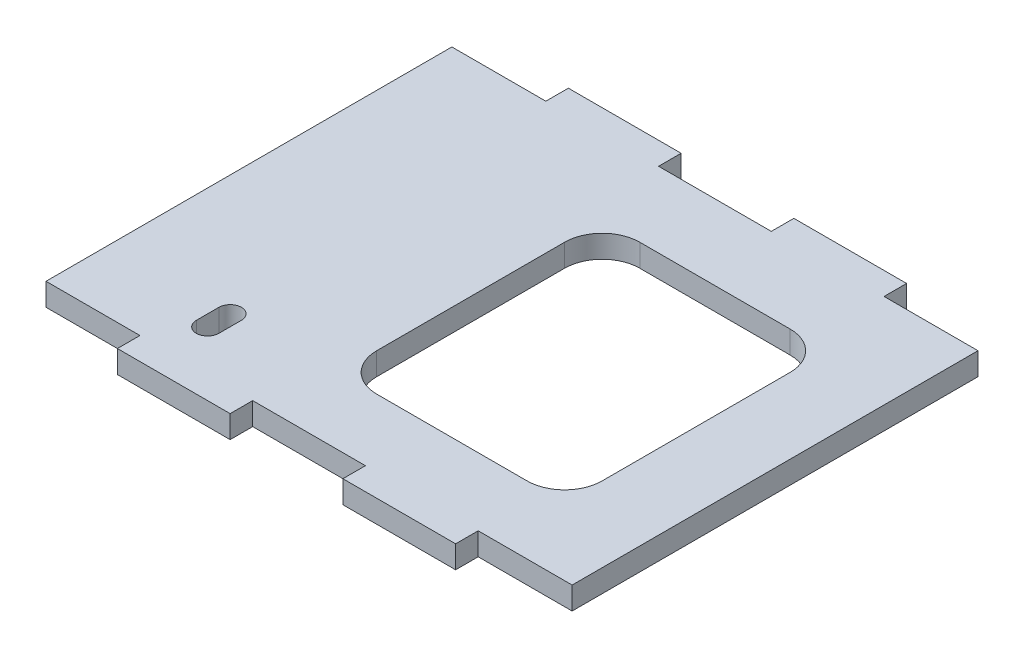
ISO-10303-21;
HEADER;
FILE_DESCRIPTION(('STEP AP214'),'2;1');
FILE_NAME('part.step','',(''),(''),'','','');
FILE_SCHEMA(('AUTOMOTIVE_DESIGN { 1 0 10303 214 1 1 1 1 }'));
ENDSEC;
DATA;
#1=APPLICATION_CONTEXT('core data for automotive mechanical design processes');
#2=APPLICATION_PROTOCOL_DEFINITION('international standard','automotive_design',2000,#1);
#3=PRODUCT_CONTEXT('',#1,'mechanical');
#4=PRODUCT('Part','Part','',(#3));
#5=PRODUCT_RELATED_PRODUCT_CATEGORY('part','',(#4));
#6=PRODUCT_DEFINITION_FORMATION('','',#4);
#7=PRODUCT_DEFINITION_CONTEXT('part definition',#1,'design');
#8=PRODUCT_DEFINITION('design','',#6,#7);
#9=PRODUCT_DEFINITION_SHAPE('','',#8);
#10=(LENGTH_UNIT() NAMED_UNIT(*) SI_UNIT(.MILLI.,.METRE.));
#11=(NAMED_UNIT(*) PLANE_ANGLE_UNIT() SI_UNIT($,.RADIAN.));
#12=(NAMED_UNIT(*) SI_UNIT($,.STERADIAN.) SOLID_ANGLE_UNIT());
#13=UNCERTAINTY_MEASURE_WITH_UNIT(LENGTH_MEASURE(1.E-05),#10,'distance_accuracy_value','');
#14=(GEOMETRIC_REPRESENTATION_CONTEXT(3) GLOBAL_UNCERTAINTY_ASSIGNED_CONTEXT((#13)) GLOBAL_UNIT_ASSIGNED_CONTEXT((#10,
#11,#12)) REPRESENTATION_CONTEXT('',''));
#15=CARTESIAN_POINT('',(0.,0.,0.));
#16=DIRECTION('',(0.,0.,1.));
#17=DIRECTION('',(1.,0.,0.));
#18=AXIS2_PLACEMENT_3D('',#15,#16,#17);
#19=CARTESIAN_POINT('',(-34.9999999999999,3.,27.0000000000001));
#20=DIRECTION('',(1.,0.,0.));
#21=DIRECTION('',(0.,0.,-1.));
#22=AXIS2_PLACEMENT_3D('',#19,#20,#21);
#23=PLANE('',#22);
#24=DIRECTION('',(0.,0.,1.));
#25=VECTOR('',#24,1.);
#26=CARTESIAN_POINT('',(-34.9999999999999,0.,27.0000000000001));
#27=LINE('',#26,#25);
#28=CARTESIAN_POINT('',(-34.9999999999999,0.,-27.));
#29=VERTEX_POINT('',#28);
#30=CARTESIAN_POINT('',(-34.9999999999999,0.,27.0000000000001));
#31=VERTEX_POINT('',#30);
#32=EDGE_CURVE('E326',#29,#31,#27,.T.);
#33=ORIENTED_EDGE('',*,*,#32,.T.);
#34=DIRECTION('',(0.,-1.,0.));
#35=VECTOR('',#34,1.);
#36=CARTESIAN_POINT('',(-34.9999999999999,3.,27.0000000000001));
#37=LINE('',#36,#35);
#38=CARTESIAN_POINT('',(-34.9999999999999,3.,27.0000000000001));
#39=VERTEX_POINT('',#38);
#40=EDGE_CURVE('E11',#39,#31,#37,.T.);
#41=ORIENTED_EDGE('',*,*,#40,.F.);
#42=DIRECTION('',(0.,0.,1.));
#43=VECTOR('',#42,1.);
#44=CARTESIAN_POINT('',(-34.9999999999999,3.,27.0000000000001));
#45=LINE('',#44,#43);
#46=CARTESIAN_POINT('',(-34.9999999999999,3.,-27.));
#47=VERTEX_POINT('',#46);
#48=EDGE_CURVE('E341',#47,#39,#45,.T.);
#49=ORIENTED_EDGE('',*,*,#48,.F.);
#50=DIRECTION('',(0.,-1.,0.));
#51=VECTOR('',#50,1.);
#52=CARTESIAN_POINT('',(-34.9999999999999,3.,-27.));
#53=LINE('',#52,#51);
#54=EDGE_CURVE('E383',#47,#29,#53,.T.);
#55=ORIENTED_EDGE('',*,*,#54,.T.);
#56=EDGE_LOOP('',(#33,#41,#49,#55));
#57=FACE_BOUND('',#56,.T.);
#58=ADVANCED_FACE('F32',(#57),#23,.F.);
#59=CARTESIAN_POINT('',(-22.4999999999999,3.,27.0000000000001));
#60=DIRECTION('',(0.,0.,-1.));
#61=DIRECTION('',(-1.,0.,0.));
#62=AXIS2_PLACEMENT_3D('',#59,#60,#61);
#63=PLANE('',#62);
#64=DIRECTION('',(1.,0.,0.));
#65=VECTOR('',#64,1.);
#66=CARTESIAN_POINT('',(-22.4999999999999,0.,27.0000000000001));
#67=LINE('',#66,#65);
#68=CARTESIAN_POINT('',(-22.4999999999999,0.,27.0000000000001));
#69=VERTEX_POINT('',#68);
#70=EDGE_CURVE('E386',#31,#69,#67,.T.);
#71=ORIENTED_EDGE('',*,*,#70,.T.);
#72=DIRECTION('',(0.,-1.,0.));
#73=VECTOR('',#72,1.);
#74=CARTESIAN_POINT('',(-22.4999999999999,3.,27.0000000000001));
#75=LINE('',#74,#73);
#76=CARTESIAN_POINT('',(-22.4999999999999,3.,27.0000000000001));
#77=VERTEX_POINT('',#76);
#78=EDGE_CURVE('E39',#77,#69,#75,.T.);
#79=ORIENTED_EDGE('',*,*,#78,.F.);
#80=DIRECTION('',(1.,0.,0.));
#81=VECTOR('',#80,1.);
#82=CARTESIAN_POINT('',(-22.4999999999999,3.,27.0000000000001));
#83=LINE('',#82,#81);
#84=EDGE_CURVE('E344',#39,#77,#83,.T.);
#85=ORIENTED_EDGE('',*,*,#84,.F.);
#86=ORIENTED_EDGE('',*,*,#40,.T.);
#87=EDGE_LOOP('',(#71,#79,#85,#86));
#88=FACE_BOUND('',#87,.T.);
#89=ADVANCED_FACE('F502',(#88),#63,.F.);
#90=CARTESIAN_POINT('',(-22.5,3.,30.0000000000002));
#91=DIRECTION('',(1.,0.,0.));
#92=DIRECTION('',(0.,0.,-1.));
#93=AXIS2_PLACEMENT_3D('',#90,#91,#92);
#94=PLANE('',#93);
#95=DIRECTION('',(0.,0.,1.));
#96=VECTOR('',#95,1.);
#97=CARTESIAN_POINT('',(-22.5,0.,30.0000000000002));
#98=LINE('',#97,#96);
#99=CARTESIAN_POINT('',(-22.5,0.,30.0000000000002));
#100=VERTEX_POINT('',#99);
#101=EDGE_CURVE('E388',#69,#100,#98,.T.);
#102=ORIENTED_EDGE('',*,*,#101,.T.);
#103=DIRECTION('',(0.,-1.,0.));
#104=VECTOR('',#103,1.);
#105=CARTESIAN_POINT('',(-22.5,3.,30.0000000000002));
#106=LINE('',#105,#104);
#107=CARTESIAN_POINT('',(-22.5,3.,30.0000000000002));
#108=VERTEX_POINT('',#107);
#109=EDGE_CURVE('E473',#108,#100,#106,.T.);
#110=ORIENTED_EDGE('',*,*,#109,.F.);
#111=DIRECTION('',(0.,0.,1.));
#112=VECTOR('',#111,1.);
#113=CARTESIAN_POINT('',(-22.5,3.,30.0000000000002));
#114=LINE('',#113,#112);
#115=EDGE_CURVE('E347',#77,#108,#114,.T.);
#116=ORIENTED_EDGE('',*,*,#115,.F.);
#117=ORIENTED_EDGE('',*,*,#78,.T.);
#118=EDGE_LOOP('',(#102,#110,#116,#117));
#119=FACE_BOUND('',#118,.T.);
#120=ADVANCED_FACE('F480',(#119),#94,.F.);
#121=CARTESIAN_POINT('',(-7.49999999999995,3.,30.0000000000001));
#122=DIRECTION('',(0.,0.,-1.));
#123=DIRECTION('',(-1.,0.,0.));
#124=AXIS2_PLACEMENT_3D('',#121,#122,#123);
#125=PLANE('',#124);
#126=DIRECTION('',(1.,0.,0.));
#127=VECTOR('',#126,1.);
#128=CARTESIAN_POINT('',(-7.49999999999995,0.,30.0000000000001));
#129=LINE('',#128,#127);
#130=CARTESIAN_POINT('',(-7.49999999999995,0.,30.0000000000001));
#131=VERTEX_POINT('',#130);
#132=EDGE_CURVE('E390',#100,#131,#129,.T.);
#133=ORIENTED_EDGE('',*,*,#132,.T.);
#134=DIRECTION('',(0.,-1.,0.));
#135=VECTOR('',#134,1.);
#136=CARTESIAN_POINT('',(-7.49999999999995,3.,30.0000000000001));
#137=LINE('',#136,#135);
#138=CARTESIAN_POINT('',(-7.49999999999995,3.,30.0000000000001));
#139=VERTEX_POINT('',#138);
#140=EDGE_CURVE('E470',#139,#131,#137,.T.);
#141=ORIENTED_EDGE('',*,*,#140,.F.);
#142=DIRECTION('',(1.,0.,0.));
#143=VECTOR('',#142,1.);
#144=CARTESIAN_POINT('',(-7.49999999999995,3.,30.0000000000001));
#145=LINE('',#144,#143);
#146=EDGE_CURVE('E349',#108,#139,#145,.T.);
#147=ORIENTED_EDGE('',*,*,#146,.F.);
#148=ORIENTED_EDGE('',*,*,#109,.T.);
#149=EDGE_LOOP('',(#133,#141,#147,#148));
#150=FACE_BOUND('',#149,.T.);
#151=ADVANCED_FACE('F490',(#150),#125,.F.);
#152=CARTESIAN_POINT('',(-7.49999999999995,3.,27.0000000000001));
#153=DIRECTION('',(-1.,0.,0.));
#154=DIRECTION('',(0.,0.,1.));
#155=AXIS2_PLACEMENT_3D('',#152,#153,#154);
#156=PLANE('',#155);
#157=DIRECTION('',(0.,0.,-1.));
#158=VECTOR('',#157,1.);
#159=CARTESIAN_POINT('',(-7.49999999999995,0.,27.0000000000001));
#160=LINE('',#159,#158);
#161=CARTESIAN_POINT('',(-7.49999999999995,0.,27.0000000000001));
#162=VERTEX_POINT('',#161);
#163=EDGE_CURVE('E392',#131,#162,#160,.T.);
#164=ORIENTED_EDGE('',*,*,#163,.T.);
#165=DIRECTION('',(0.,-1.,0.));
#166=VECTOR('',#165,1.);
#167=CARTESIAN_POINT('',(-7.49999999999995,3.,27.0000000000001));
#168=LINE('',#167,#166);
#169=CARTESIAN_POINT('',(-7.49999999999995,3.,27.0000000000001));
#170=VERTEX_POINT('',#169);
#171=EDGE_CURVE('E467',#170,#162,#168,.T.);
#172=ORIENTED_EDGE('',*,*,#171,.F.);
#173=DIRECTION('',(0.,0.,-1.));
#174=VECTOR('',#173,1.);
#175=CARTESIAN_POINT('',(-7.49999999999995,3.,27.0000000000001));
#176=LINE('',#175,#174);
#177=EDGE_CURVE('E351',#139,#170,#176,.T.);
#178=ORIENTED_EDGE('',*,*,#177,.F.);
#179=ORIENTED_EDGE('',*,*,#140,.T.);
#180=EDGE_LOOP('',(#164,#172,#178,#179));
#181=FACE_BOUND('',#180,.T.);
#182=ADVANCED_FACE('F494',(#181),#156,.F.);
#183=CARTESIAN_POINT('',(7.50000000000017,3.,27.));
#184=DIRECTION('',(0.,0.,-1.));
#185=DIRECTION('',(-1.,0.,0.));
#186=AXIS2_PLACEMENT_3D('',#183,#184,#185);
#187=PLANE('',#186);
#188=DIRECTION('',(1.,0.,0.));
#189=VECTOR('',#188,1.);
#190=CARTESIAN_POINT('',(7.50000000000017,0.,27.));
#191=LINE('',#190,#189);
#192=CARTESIAN_POINT('',(7.50000000000017,0.,27.));
#193=VERTEX_POINT('',#192);
#194=EDGE_CURVE('E394',#162,#193,#191,.T.);
#195=ORIENTED_EDGE('',*,*,#194,.T.);
#196=DIRECTION('',(0.,-1.,0.));
#197=VECTOR('',#196,1.);
#198=CARTESIAN_POINT('',(7.50000000000017,3.,27.));
#199=LINE('',#198,#197);
#200=CARTESIAN_POINT('',(7.50000000000017,3.,27.));
#201=VERTEX_POINT('',#200);
#202=EDGE_CURVE('E464',#201,#193,#199,.T.);
#203=ORIENTED_EDGE('',*,*,#202,.F.);
#204=DIRECTION('',(1.,0.,0.));
#205=VECTOR('',#204,1.);
#206=CARTESIAN_POINT('',(7.50000000000017,3.,27.));
#207=LINE('',#206,#205);
#208=EDGE_CURVE('E353',#170,#201,#207,.T.);
#209=ORIENTED_EDGE('',*,*,#208,.F.);
#210=ORIENTED_EDGE('',*,*,#171,.T.);
#211=EDGE_LOOP('',(#195,#203,#209,#210));
#212=FACE_BOUND('',#211,.T.);
#213=ADVANCED_FACE('F575',(#212),#187,.F.);
#214=CARTESIAN_POINT('',(7.50000000000017,3.,30.0000000000001));
#215=DIRECTION('',(1.,0.,0.));
#216=DIRECTION('',(0.,0.,-1.));
#217=AXIS2_PLACEMENT_3D('',#214,#215,#216);
#218=PLANE('',#217);
#219=DIRECTION('',(0.,0.,1.));
#220=VECTOR('',#219,1.);
#221=CARTESIAN_POINT('',(7.50000000000017,0.,30.0000000000001));
#222=LINE('',#221,#220);
#223=CARTESIAN_POINT('',(7.50000000000017,0.,30.0000000000001));
#224=VERTEX_POINT('',#223);
#225=EDGE_CURVE('E396',#193,#224,#222,.T.);
#226=ORIENTED_EDGE('',*,*,#225,.T.);
#227=DIRECTION('',(0.,-1.,0.));
#228=VECTOR('',#227,1.);
#229=CARTESIAN_POINT('',(7.50000000000017,3.,30.0000000000001));
#230=LINE('',#229,#228);
#231=CARTESIAN_POINT('',(7.50000000000017,3.,30.0000000000001));
#232=VERTEX_POINT('',#231);
#233=EDGE_CURVE('E461',#232,#224,#230,.T.);
#234=ORIENTED_EDGE('',*,*,#233,.F.);
#235=DIRECTION('',(0.,0.,1.));
#236=VECTOR('',#235,1.);
#237=CARTESIAN_POINT('',(7.50000000000017,3.,30.0000000000001));
#238=LINE('',#237,#236);
#239=EDGE_CURVE('E355',#201,#232,#238,.T.);
#240=ORIENTED_EDGE('',*,*,#239,.F.);
#241=ORIENTED_EDGE('',*,*,#202,.T.);
#242=EDGE_LOOP('',(#226,#234,#240,#241));
#243=FACE_BOUND('',#242,.T.);
#244=ADVANCED_FACE('F573',(#243),#218,.F.);
#245=CARTESIAN_POINT('',(22.5000000000001,3.,30.0000000000001));
#246=DIRECTION('',(0.,0.,-1.));
#247=DIRECTION('',(-1.,0.,0.));
#248=AXIS2_PLACEMENT_3D('',#245,#246,#247);
#249=PLANE('',#248);
#250=DIRECTION('',(1.,0.,0.));
#251=VECTOR('',#250,1.);
#252=CARTESIAN_POINT('',(22.5000000000001,0.,30.0000000000001));
#253=LINE('',#252,#251);
#254=CARTESIAN_POINT('',(22.5000000000001,0.,30.0000000000001));
#255=VERTEX_POINT('',#254);
#256=EDGE_CURVE('E398',#224,#255,#253,.T.);
#257=ORIENTED_EDGE('',*,*,#256,.T.);
#258=DIRECTION('',(0.,-1.,0.));
#259=VECTOR('',#258,1.);
#260=CARTESIAN_POINT('',(22.5000000000001,3.,30.0000000000001));
#261=LINE('',#260,#259);
#262=CARTESIAN_POINT('',(22.5000000000001,3.,30.0000000000001));
#263=VERTEX_POINT('',#262);
#264=EDGE_CURVE('E458',#263,#255,#261,.T.);
#265=ORIENTED_EDGE('',*,*,#264,.F.);
#266=DIRECTION('',(1.,0.,0.));
#267=VECTOR('',#266,1.);
#268=CARTESIAN_POINT('',(22.5000000000001,3.,30.0000000000001));
#269=LINE('',#268,#267);
#270=EDGE_CURVE('E357',#232,#263,#269,.T.);
#271=ORIENTED_EDGE('',*,*,#270,.F.);
#272=ORIENTED_EDGE('',*,*,#233,.T.);
#273=EDGE_LOOP('',(#257,#265,#271,#272));
#274=FACE_BOUND('',#273,.T.);
#275=ADVANCED_FACE('F568',(#274),#249,.F.);
#276=CARTESIAN_POINT('',(22.5000000000001,3.,27.0000000000001));
#277=DIRECTION('',(-1.,0.,0.));
#278=DIRECTION('',(0.,0.,1.));
#279=AXIS2_PLACEMENT_3D('',#276,#277,#278);
#280=PLANE('',#279);
#281=DIRECTION('',(0.,0.,-1.));
#282=VECTOR('',#281,1.);
#283=CARTESIAN_POINT('',(22.5000000000001,0.,27.0000000000001));
#284=LINE('',#283,#282);
#285=CARTESIAN_POINT('',(22.5000000000001,0.,27.0000000000001));
#286=VERTEX_POINT('',#285);
#287=EDGE_CURVE('E400',#255,#286,#284,.T.);
#288=ORIENTED_EDGE('',*,*,#287,.T.);
#289=DIRECTION('',(0.,-1.,0.));
#290=VECTOR('',#289,1.);
#291=CARTESIAN_POINT('',(22.5000000000001,3.,27.0000000000001));
#292=LINE('',#291,#290);
#293=CARTESIAN_POINT('',(22.5000000000001,3.,27.0000000000001));
#294=VERTEX_POINT('',#293);
#295=EDGE_CURVE('E455',#294,#286,#292,.T.);
#296=ORIENTED_EDGE('',*,*,#295,.F.);
#297=DIRECTION('',(0.,0.,-1.));
#298=VECTOR('',#297,1.);
#299=CARTESIAN_POINT('',(22.5000000000001,3.,27.0000000000001));
#300=LINE('',#299,#298);
#301=EDGE_CURVE('E359',#263,#294,#300,.T.);
#302=ORIENTED_EDGE('',*,*,#301,.F.);
#303=ORIENTED_EDGE('',*,*,#264,.T.);
#304=EDGE_LOOP('',(#288,#296,#302,#303));
#305=FACE_BOUND('',#304,.T.);
#306=ADVANCED_FACE('F563',(#305),#280,.F.);
#307=CARTESIAN_POINT('',(35.0000000000003,3.,27.));
#308=DIRECTION('',(0.,0.,-1.));
#309=DIRECTION('',(-1.,0.,0.));
#310=AXIS2_PLACEMENT_3D('',#307,#308,#309);
#311=PLANE('',#310);
#312=DIRECTION('',(1.,0.,0.));
#313=VECTOR('',#312,1.);
#314=CARTESIAN_POINT('',(35.0000000000003,0.,27.));
#315=LINE('',#314,#313);
#316=CARTESIAN_POINT('',(35.0000000000003,0.,27.));
#317=VERTEX_POINT('',#316);
#318=EDGE_CURVE('E402',#286,#317,#315,.T.);
#319=ORIENTED_EDGE('',*,*,#318,.T.);
#320=DIRECTION('',(0.,-1.,0.));
#321=VECTOR('',#320,1.);
#322=CARTESIAN_POINT('',(35.0000000000003,3.,27.));
#323=LINE('',#322,#321);
#324=CARTESIAN_POINT('',(35.0000000000003,3.,27.));
#325=VERTEX_POINT('',#324);
#326=EDGE_CURVE('E452',#325,#317,#323,.T.);
#327=ORIENTED_EDGE('',*,*,#326,.F.);
#328=DIRECTION('',(1.,0.,0.));
#329=VECTOR('',#328,1.);
#330=CARTESIAN_POINT('',(35.0000000000003,3.,27.));
#331=LINE('',#330,#329);
#332=EDGE_CURVE('E361',#294,#325,#331,.T.);
#333=ORIENTED_EDGE('',*,*,#332,.F.);
#334=ORIENTED_EDGE('',*,*,#295,.T.);
#335=EDGE_LOOP('',(#319,#327,#333,#334));
#336=FACE_BOUND('',#335,.T.);
#337=ADVANCED_FACE('F559',(#336),#311,.F.);
#338=CARTESIAN_POINT('',(35.0000000000001,3.,-27.0000000000001));
#339=DIRECTION('',(-1.,0.,0.));
#340=DIRECTION('',(0.,0.,1.));
#341=AXIS2_PLACEMENT_3D('',#338,#339,#340);
#342=PLANE('',#341);
#343=DIRECTION('',(0.,0.,-1.));
#344=VECTOR('',#343,1.);
#345=CARTESIAN_POINT('',(35.0000000000001,0.,-27.0000000000001));
#346=LINE('',#345,#344);
#347=CARTESIAN_POINT('',(35.0000000000001,0.,-27.0000000000001));
#348=VERTEX_POINT('',#347);
#349=EDGE_CURVE('E404',#317,#348,#346,.T.);
#350=ORIENTED_EDGE('',*,*,#349,.T.);
#351=DIRECTION('',(0.,-1.,0.));
#352=VECTOR('',#351,1.);
#353=CARTESIAN_POINT('',(35.0000000000001,3.,-27.0000000000001));
#354=LINE('',#353,#352);
#355=CARTESIAN_POINT('',(35.0000000000001,3.,-27.0000000000001));
#356=VERTEX_POINT('',#355);
#357=EDGE_CURVE('E449',#356,#348,#354,.T.);
#358=ORIENTED_EDGE('',*,*,#357,.F.);
#359=DIRECTION('',(0.,0.,-1.));
#360=VECTOR('',#359,1.);
#361=CARTESIAN_POINT('',(35.0000000000001,3.,-27.0000000000001));
#362=LINE('',#361,#360);
#363=EDGE_CURVE('E363',#325,#356,#362,.T.);
#364=ORIENTED_EDGE('',*,*,#363,.F.);
#365=ORIENTED_EDGE('',*,*,#326,.T.);
#366=EDGE_LOOP('',(#350,#358,#364,#365));
#367=FACE_BOUND('',#366,.T.);
#368=ADVANCED_FACE('F554',(#367),#342,.F.);
#369=CARTESIAN_POINT('',(22.5,3.,-27.0000000000001));
#370=DIRECTION('',(0.,0.,1.));
#371=DIRECTION('',(1.,0.,0.));
#372=AXIS2_PLACEMENT_3D('',#369,#370,#371);
#373=PLANE('',#372);
#374=DIRECTION('',(-1.,0.,0.));
#375=VECTOR('',#374,1.);
#376=CARTESIAN_POINT('',(22.5,0.,-27.0000000000001));
#377=LINE('',#376,#375);
#378=CARTESIAN_POINT('',(22.5,0.,-27.0000000000001));
#379=VERTEX_POINT('',#378);
#380=EDGE_CURVE('E406',#348,#379,#377,.T.);
#381=ORIENTED_EDGE('',*,*,#380,.T.);
#382=DIRECTION('',(0.,-1.,0.));
#383=VECTOR('',#382,1.);
#384=CARTESIAN_POINT('',(22.5,3.,-27.0000000000001));
#385=LINE('',#384,#383);
#386=CARTESIAN_POINT('',(22.5,3.,-27.0000000000001));
#387=VERTEX_POINT('',#386);
#388=EDGE_CURVE('E446',#387,#379,#385,.T.);
#389=ORIENTED_EDGE('',*,*,#388,.F.);
#390=DIRECTION('',(-1.,0.,0.));
#391=VECTOR('',#390,1.);
#392=CARTESIAN_POINT('',(22.5,3.,-27.0000000000001));
#393=LINE('',#392,#391);
#394=EDGE_CURVE('E365',#356,#387,#393,.T.);
#395=ORIENTED_EDGE('',*,*,#394,.F.);
#396=ORIENTED_EDGE('',*,*,#357,.T.);
#397=EDGE_LOOP('',(#381,#389,#395,#396));
#398=FACE_BOUND('',#397,.T.);
#399=ADVANCED_FACE('F548',(#398),#373,.F.);
#400=CARTESIAN_POINT('',(22.5000000000002,3.,-30.0000000000001));
#401=DIRECTION('',(-1.,0.,0.));
#402=DIRECTION('',(0.,0.,1.));
#403=AXIS2_PLACEMENT_3D('',#400,#401,#402);
#404=PLANE('',#403);
#405=DIRECTION('',(0.,0.,-1.));
#406=VECTOR('',#405,1.);
#407=CARTESIAN_POINT('',(22.5000000000002,0.,-30.0000000000001));
#408=LINE('',#407,#406);
#409=CARTESIAN_POINT('',(22.5000000000002,0.,-30.0000000000001));
#410=VERTEX_POINT('',#409);
#411=EDGE_CURVE('E408',#379,#410,#408,.T.);
#412=ORIENTED_EDGE('',*,*,#411,.T.);
#413=DIRECTION('',(0.,-1.,0.));
#414=VECTOR('',#413,1.);
#415=CARTESIAN_POINT('',(22.5000000000002,3.,-30.0000000000001));
#416=LINE('',#415,#414);
#417=CARTESIAN_POINT('',(22.5000000000002,3.,-30.0000000000001));
#418=VERTEX_POINT('',#417);
#419=EDGE_CURVE('E443',#418,#410,#416,.T.);
#420=ORIENTED_EDGE('',*,*,#419,.F.);
#421=DIRECTION('',(0.,0.,-1.));
#422=VECTOR('',#421,1.);
#423=CARTESIAN_POINT('',(22.5000000000002,3.,-30.0000000000001));
#424=LINE('',#423,#422);
#425=EDGE_CURVE('E367',#387,#418,#424,.T.);
#426=ORIENTED_EDGE('',*,*,#425,.F.);
#427=ORIENTED_EDGE('',*,*,#388,.T.);
#428=EDGE_LOOP('',(#412,#420,#426,#427));
#429=FACE_BOUND('',#428,.T.);
#430=ADVANCED_FACE('F544',(#429),#404,.F.);
#431=CARTESIAN_POINT('',(7.50000000000006,3.,-30.0000000000001));
#432=DIRECTION('',(0.,0.,1.));
#433=DIRECTION('',(1.,0.,0.));
#434=AXIS2_PLACEMENT_3D('',#431,#432,#433);
#435=PLANE('',#434);
#436=DIRECTION('',(-1.,0.,0.));
#437=VECTOR('',#436,1.);
#438=CARTESIAN_POINT('',(7.50000000000006,0.,-30.0000000000001));
#439=LINE('',#438,#437);
#440=CARTESIAN_POINT('',(7.50000000000006,0.,-30.0000000000001));
#441=VERTEX_POINT('',#440);
#442=EDGE_CURVE('E410',#410,#441,#439,.T.);
#443=ORIENTED_EDGE('',*,*,#442,.T.);
#444=DIRECTION('',(0.,-1.,0.));
#445=VECTOR('',#444,1.);
#446=CARTESIAN_POINT('',(7.50000000000006,3.,-30.0000000000001));
#447=LINE('',#446,#445);
#448=CARTESIAN_POINT('',(7.50000000000006,3.,-30.0000000000001));
#449=VERTEX_POINT('',#448);
#450=EDGE_CURVE('E440',#449,#441,#447,.T.);
#451=ORIENTED_EDGE('',*,*,#450,.F.);
#452=DIRECTION('',(-1.,0.,0.));
#453=VECTOR('',#452,1.);
#454=CARTESIAN_POINT('',(7.50000000000006,3.,-30.0000000000001));
#455=LINE('',#454,#453);
#456=EDGE_CURVE('E369',#418,#449,#455,.T.);
#457=ORIENTED_EDGE('',*,*,#456,.F.);
#458=ORIENTED_EDGE('',*,*,#419,.T.);
#459=EDGE_LOOP('',(#443,#451,#457,#458));
#460=FACE_BOUND('',#459,.T.);
#461=ADVANCED_FACE('F539',(#460),#435,.F.);
#462=CARTESIAN_POINT('',(7.50000000000006,3.,-27.0000000000001));
#463=DIRECTION('',(1.,0.,0.));
#464=DIRECTION('',(0.,0.,-1.));
#465=AXIS2_PLACEMENT_3D('',#462,#463,#464);
#466=PLANE('',#465);
#467=DIRECTION('',(0.,0.,1.));
#468=VECTOR('',#467,1.);
#469=CARTESIAN_POINT('',(7.50000000000006,0.,-27.0000000000001));
#470=LINE('',#469,#468);
#471=CARTESIAN_POINT('',(7.50000000000006,0.,-27.0000000000001));
#472=VERTEX_POINT('',#471);
#473=EDGE_CURVE('E412',#441,#472,#470,.T.);
#474=ORIENTED_EDGE('',*,*,#473,.T.);
#475=DIRECTION('',(0.,-1.,0.));
#476=VECTOR('',#475,1.);
#477=CARTESIAN_POINT('',(7.50000000000006,3.,-27.0000000000001));
#478=LINE('',#477,#476);
#479=CARTESIAN_POINT('',(7.50000000000006,3.,-27.0000000000001));
#480=VERTEX_POINT('',#479);
#481=EDGE_CURVE('E437',#480,#472,#478,.T.);
#482=ORIENTED_EDGE('',*,*,#481,.F.);
#483=DIRECTION('',(0.,0.,1.));
#484=VECTOR('',#483,1.);
#485=CARTESIAN_POINT('',(7.50000000000006,3.,-27.0000000000001));
#486=LINE('',#485,#484);
#487=EDGE_CURVE('E371',#449,#480,#486,.T.);
#488=ORIENTED_EDGE('',*,*,#487,.F.);
#489=ORIENTED_EDGE('',*,*,#450,.T.);
#490=EDGE_LOOP('',(#474,#482,#488,#489));
#491=FACE_BOUND('',#490,.T.);
#492=ADVANCED_FACE('F533',(#491),#466,.F.);
#493=CARTESIAN_POINT('',(-7.49999999999984,3.,-27.));
#494=DIRECTION('',(0.,0.,1.));
#495=DIRECTION('',(1.,0.,0.));
#496=AXIS2_PLACEMENT_3D('',#493,#494,#495);
#497=PLANE('',#496);
#498=DIRECTION('',(-1.,0.,0.));
#499=VECTOR('',#498,1.);
#500=CARTESIAN_POINT('',(-7.49999999999984,0.,-27.));
#501=LINE('',#500,#499);
#502=CARTESIAN_POINT('',(-7.49999999999984,0.,-27.));
#503=VERTEX_POINT('',#502);
#504=EDGE_CURVE('E414',#472,#503,#501,.T.);
#505=ORIENTED_EDGE('',*,*,#504,.T.);
#506=DIRECTION('',(0.,-1.,0.));
#507=VECTOR('',#506,1.);
#508=CARTESIAN_POINT('',(-7.49999999999984,3.,-27.));
#509=LINE('',#508,#507);
#510=CARTESIAN_POINT('',(-7.49999999999984,3.,-27.));
#511=VERTEX_POINT('',#510);
#512=EDGE_CURVE('E434',#511,#503,#509,.T.);
#513=ORIENTED_EDGE('',*,*,#512,.F.);
#514=DIRECTION('',(-1.,0.,0.));
#515=VECTOR('',#514,1.);
#516=CARTESIAN_POINT('',(-7.49999999999984,3.,-27.));
#517=LINE('',#516,#515);
#518=EDGE_CURVE('E373',#480,#511,#517,.T.);
#519=ORIENTED_EDGE('',*,*,#518,.F.);
#520=ORIENTED_EDGE('',*,*,#481,.T.);
#521=EDGE_LOOP('',(#505,#513,#519,#520));
#522=FACE_BOUND('',#521,.T.);
#523=ADVANCED_FACE('F529',(#522),#497,.F.);
#524=CARTESIAN_POINT('',(-7.49999999999984,3.,-30.));
#525=DIRECTION('',(-1.,0.,0.));
#526=DIRECTION('',(0.,0.,1.));
#527=AXIS2_PLACEMENT_3D('',#524,#525,#526);
#528=PLANE('',#527);
#529=DIRECTION('',(0.,0.,-1.));
#530=VECTOR('',#529,1.);
#531=CARTESIAN_POINT('',(-7.49999999999984,0.,-30.));
#532=LINE('',#531,#530);
#533=CARTESIAN_POINT('',(-7.49999999999984,0.,-30.));
#534=VERTEX_POINT('',#533);
#535=EDGE_CURVE('E416',#503,#534,#532,.T.);
#536=ORIENTED_EDGE('',*,*,#535,.T.);
#537=DIRECTION('',(0.,-1.,0.));
#538=VECTOR('',#537,1.);
#539=CARTESIAN_POINT('',(-7.49999999999984,3.,-30.));
#540=LINE('',#539,#538);
#541=CARTESIAN_POINT('',(-7.49999999999984,3.,-30.));
#542=VERTEX_POINT('',#541);
#543=EDGE_CURVE('E431',#542,#534,#540,.T.);
#544=ORIENTED_EDGE('',*,*,#543,.F.);
#545=DIRECTION('',(0.,0.,-1.));
#546=VECTOR('',#545,1.);
#547=CARTESIAN_POINT('',(-7.49999999999984,3.,-30.));
#548=LINE('',#547,#546);
#549=EDGE_CURVE('E375',#511,#542,#548,.T.);
#550=ORIENTED_EDGE('',*,*,#549,.F.);
#551=ORIENTED_EDGE('',*,*,#512,.T.);
#552=EDGE_LOOP('',(#536,#544,#550,#551));
#553=FACE_BOUND('',#552,.T.);
#554=ADVANCED_FACE('F524',(#553),#528,.F.);
#555=CARTESIAN_POINT('',(-22.4999999999999,3.,-30.));
#556=DIRECTION('',(0.,0.,1.));
#557=DIRECTION('',(1.,0.,0.));
#558=AXIS2_PLACEMENT_3D('',#555,#556,#557);
#559=PLANE('',#558);
#560=DIRECTION('',(-1.,0.,0.));
#561=VECTOR('',#560,1.);
#562=CARTESIAN_POINT('',(-22.4999999999999,0.,-30.));
#563=LINE('',#562,#561);
#564=CARTESIAN_POINT('',(-22.4999999999999,0.,-30.));
#565=VERTEX_POINT('',#564);
#566=EDGE_CURVE('E418',#534,#565,#563,.T.);
#567=ORIENTED_EDGE('',*,*,#566,.T.);
#568=DIRECTION('',(0.,-1.,0.));
#569=VECTOR('',#568,1.);
#570=CARTESIAN_POINT('',(-22.4999999999999,3.,-30.));
#571=LINE('',#570,#569);
#572=CARTESIAN_POINT('',(-22.4999999999999,3.,-30.));
#573=VERTEX_POINT('',#572);
#574=EDGE_CURVE('E428',#573,#565,#571,.T.);
#575=ORIENTED_EDGE('',*,*,#574,.F.);
#576=DIRECTION('',(-1.,0.,0.));
#577=VECTOR('',#576,1.);
#578=CARTESIAN_POINT('',(-22.4999999999999,3.,-30.));
#579=LINE('',#578,#577);
#580=EDGE_CURVE('E377',#542,#573,#579,.T.);
#581=ORIENTED_EDGE('',*,*,#580,.F.);
#582=ORIENTED_EDGE('',*,*,#543,.T.);
#583=EDGE_LOOP('',(#567,#575,#581,#582));
#584=FACE_BOUND('',#583,.T.);
#585=ADVANCED_FACE('F518',(#584),#559,.F.);
#586=CARTESIAN_POINT('',(-22.4999999999999,3.,-27.));
#587=DIRECTION('',(1.,0.,0.));
#588=DIRECTION('',(0.,0.,-1.));
#589=AXIS2_PLACEMENT_3D('',#586,#587,#588);
#590=PLANE('',#589);
#591=DIRECTION('',(0.,0.,1.));
#592=VECTOR('',#591,1.);
#593=CARTESIAN_POINT('',(-22.4999999999999,0.,-27.));
#594=LINE('',#593,#592);
#595=CARTESIAN_POINT('',(-22.4999999999999,0.,-27.));
#596=VERTEX_POINT('',#595);
#597=EDGE_CURVE('E420',#565,#596,#594,.T.);
#598=ORIENTED_EDGE('',*,*,#597,.T.);
#599=DIRECTION('',(0.,-1.,0.));
#600=VECTOR('',#599,1.);
#601=CARTESIAN_POINT('',(-22.4999999999999,3.,-27.));
#602=LINE('',#601,#600);
#603=CARTESIAN_POINT('',(-22.4999999999999,3.,-27.));
#604=VERTEX_POINT('',#603);
#605=EDGE_CURVE('E425',#604,#596,#602,.T.);
#606=ORIENTED_EDGE('',*,*,#605,.F.);
#607=DIRECTION('',(0.,0.,1.));
#608=VECTOR('',#607,1.);
#609=CARTESIAN_POINT('',(-22.4999999999999,3.,-27.));
#610=LINE('',#609,#608);
#611=EDGE_CURVE('E379',#573,#604,#610,.T.);
#612=ORIENTED_EDGE('',*,*,#611,.F.);
#613=ORIENTED_EDGE('',*,*,#574,.T.);
#614=EDGE_LOOP('',(#598,#606,#612,#613));
#615=FACE_BOUND('',#614,.T.);
#616=ADVANCED_FACE('F514',(#615),#590,.F.);
#617=CARTESIAN_POINT('',(-34.9999999999999,3.,-27.));
#618=DIRECTION('',(0.,0.,1.));
#619=DIRECTION('',(1.,0.,0.));
#620=AXIS2_PLACEMENT_3D('',#617,#618,#619);
#621=PLANE('',#620);
#622=DIRECTION('',(-1.,0.,0.));
#623=VECTOR('',#622,1.);
#624=CARTESIAN_POINT('',(-34.9999999999999,0.,-27.));
#625=LINE('',#624,#623);
#626=EDGE_CURVE('E345',#596,#29,#625,.T.);
#627=ORIENTED_EDGE('',*,*,#626,.T.);
#628=ORIENTED_EDGE('',*,*,#54,.F.);
#629=DIRECTION('',(-1.,0.,0.));
#630=VECTOR('',#629,1.);
#631=CARTESIAN_POINT('',(-34.9999999999999,3.,-27.));
#632=LINE('',#631,#630);
#633=EDGE_CURVE('E381',#604,#47,#632,.T.);
#634=ORIENTED_EDGE('',*,*,#633,.F.);
#635=ORIENTED_EDGE('',*,*,#605,.T.);
#636=EDGE_LOOP('',(#627,#628,#634,#635));
#637=FACE_BOUND('',#636,.T.);
#638=ADVANCED_FACE('F509',(#637),#621,.F.);
#639=CARTESIAN_POINT('',(0.,3.,0.));
#640=DIRECTION('',(0.,-1.,0.));
#641=DIRECTION('',(0.,0.,-1.));
#642=AXIS2_PLACEMENT_3D('',#639,#640,#641);
#643=PLANE('',#642);
#644=DIRECTION('',(0.,0.,1.));
#645=VECTOR('',#644,1.);
#646=CARTESIAN_POINT('',(-20.5000000000004,3.,18.5000000000001));
#647=LINE('',#646,#645);
#648=CARTESIAN_POINT('',(-20.5000000000004,3.,18.5000000000001));
#649=VERTEX_POINT('',#648);
#650=CARTESIAN_POINT('',(-20.4999999999999,3.,21.5000000000001));
#651=VERTEX_POINT('',#650);
#652=EDGE_CURVE('E267',#649,#651,#647,.T.);
#653=ORIENTED_EDGE('',*,*,#652,.F.);
#654=CARTESIAN_POINT('',(-19.0000000000003,3.,18.5));
#655=DIRECTION('',(0.,1.,0.));
#656=DIRECTION('',(0.,0.,1.));
#657=AXIS2_PLACEMENT_3D('',#654,#655,#656);
#658=CIRCLE('',#657,1.5);
#659=CARTESIAN_POINT('',(-17.5000000000002,3.,18.5));
#660=VERTEX_POINT('',#659);
#661=EDGE_CURVE('E46',#660,#649,#658,.T.);
#662=ORIENTED_EDGE('',*,*,#661,.F.);
#663=DIRECTION('',(0.,0.,-1.));
#664=VECTOR('',#663,1.);
#665=CARTESIAN_POINT('',(-17.5000000000002,3.,18.5));
#666=LINE('',#665,#664);
#667=CARTESIAN_POINT('',(-17.4999999999998,3.,21.5));
#668=VERTEX_POINT('',#667);
#669=EDGE_CURVE('E258',#668,#660,#666,.T.);
#670=ORIENTED_EDGE('',*,*,#669,.F.);
#671=CARTESIAN_POINT('',(-18.9999999999999,3.,21.5));
#672=DIRECTION('',(0.,1.,0.));
#673=DIRECTION('',(0.,0.,1.));
#674=AXIS2_PLACEMENT_3D('',#671,#672,#673);
#675=CIRCLE('',#674,1.5);
#676=EDGE_CURVE('E261',#651,#668,#675,.T.);
#677=ORIENTED_EDGE('',*,*,#676,.F.);
#678=EDGE_LOOP('',(#653,#662,#670,#677));
#679=FACE_BOUND('',#678,.T.);
#680=DIRECTION('',(-1.,0.,0.));
#681=VECTOR('',#680,1.);
#682=CARTESIAN_POINT('',(0.,3.,-17.));
#683=LINE('',#682,#681);
#684=CARTESIAN_POINT('',(20.,3.,-17.0000000000001));
#685=VERTEX_POINT('',#684);
#686=CARTESIAN_POINT('',(0.,3.,-17.));
#687=VERTEX_POINT('',#686);
#688=EDGE_CURVE('E304',#685,#687,#683,.T.);
#689=ORIENTED_EDGE('',*,*,#688,.F.);
#690=CARTESIAN_POINT('',(19.9999999999999,3.,-12.));
#691=DIRECTION('',(0.,1.,0.));
#692=DIRECTION('',(0.,0.,-1.));
#693=AXIS2_PLACEMENT_3D('',#690,#691,#692);
#694=CIRCLE('',#693,5.);
#695=CARTESIAN_POINT('',(25.,3.,-12.));
#696=VERTEX_POINT('',#695);
#697=EDGE_CURVE('E273',#696,#685,#694,.T.);
#698=ORIENTED_EDGE('',*,*,#697,.F.);
#699=DIRECTION('',(0.,0.,-1.));
#700=VECTOR('',#699,1.);
#701=CARTESIAN_POINT('',(25.,3.,-12.));
#702=LINE('',#701,#700);
#703=CARTESIAN_POINT('',(24.9999999999999,3.,13.));
#704=VERTEX_POINT('',#703);
#705=EDGE_CURVE('E281',#704,#696,#702,.T.);
#706=ORIENTED_EDGE('',*,*,#705,.F.);
#707=CARTESIAN_POINT('',(20.,3.,13.));
#708=DIRECTION('',(0.,1.,0.));
#709=DIRECTION('',(0.,0.,-1.));
#710=AXIS2_PLACEMENT_3D('',#707,#708,#709);
#711=CIRCLE('',#710,5.);
#712=CARTESIAN_POINT('',(19.9999999999997,3.,18.));
#713=VERTEX_POINT('',#712);
#714=EDGE_CURVE('E319',#713,#704,#711,.T.);
#715=ORIENTED_EDGE('',*,*,#714,.F.);
#716=DIRECTION('',(1.,0.,0.));
#717=VECTOR('',#716,1.);
#718=CARTESIAN_POINT('',(-1.11022302462516E-13,3.,18.0000000000001));
#719=LINE('',#718,#717);
#720=CARTESIAN_POINT('',(-1.11022302462516E-13,3.,18.0000000000001));
#721=VERTEX_POINT('',#720);
#722=EDGE_CURVE('E316',#721,#713,#719,.T.);
#723=ORIENTED_EDGE('',*,*,#722,.F.);
#724=CARTESIAN_POINT('',(-6.66133814775094E-13,3.,13.0000000000001));
#725=DIRECTION('',(0.,1.,0.));
#726=DIRECTION('',(0.,0.,-1.));
#727=AXIS2_PLACEMENT_3D('',#724,#725,#726);
#728=CIRCLE('',#727,5.);
#729=CARTESIAN_POINT('',(-5.00000000000056,3.,13.0000000000001));
#730=VERTEX_POINT('',#729);
#731=EDGE_CURVE('E313',#730,#721,#728,.T.);
#732=ORIENTED_EDGE('',*,*,#731,.F.);
#733=DIRECTION('',(0.,0.,1.));
#734=VECTOR('',#733,1.);
#735=CARTESIAN_POINT('',(-5.00000000000023,3.,-12.));
#736=LINE('',#735,#734);
#737=CARTESIAN_POINT('',(-5.00000000000023,3.,-12.));
#738=VERTEX_POINT('',#737);
#739=EDGE_CURVE('E310',#738,#730,#736,.T.);
#740=ORIENTED_EDGE('',*,*,#739,.F.);
#741=CARTESIAN_POINT('',(-1.11022302462516E-13,3.,-12.));
#742=DIRECTION('',(0.,1.,0.));
#743=DIRECTION('',(0.,0.,-1.));
#744=AXIS2_PLACEMENT_3D('',#741,#742,#743);
#745=CIRCLE('',#744,5.);
#746=EDGE_CURVE('E307',#687,#738,#745,.T.);
#747=ORIENTED_EDGE('',*,*,#746,.F.);
#748=EDGE_LOOP('',(#689,#698,#706,#715,#723,#732,#740,#747));
#749=FACE_BOUND('',#748,.T.);
#750=ORIENTED_EDGE('',*,*,#48,.T.);
#751=ORIENTED_EDGE('',*,*,#84,.T.);
#752=ORIENTED_EDGE('',*,*,#115,.T.);
#753=ORIENTED_EDGE('',*,*,#146,.T.);
#754=ORIENTED_EDGE('',*,*,#177,.T.);
#755=ORIENTED_EDGE('',*,*,#208,.T.);
#756=ORIENTED_EDGE('',*,*,#239,.T.);
#757=ORIENTED_EDGE('',*,*,#270,.T.);
#758=ORIENTED_EDGE('',*,*,#301,.T.);
#759=ORIENTED_EDGE('',*,*,#332,.T.);
#760=ORIENTED_EDGE('',*,*,#363,.T.);
#761=ORIENTED_EDGE('',*,*,#394,.T.);
#762=ORIENTED_EDGE('',*,*,#425,.T.);
#763=ORIENTED_EDGE('',*,*,#456,.T.);
#764=ORIENTED_EDGE('',*,*,#487,.T.);
#765=ORIENTED_EDGE('',*,*,#518,.T.);
#766=ORIENTED_EDGE('',*,*,#549,.T.);
#767=ORIENTED_EDGE('',*,*,#580,.T.);
#768=ORIENTED_EDGE('',*,*,#611,.T.);
#769=ORIENTED_EDGE('',*,*,#633,.T.);
#770=EDGE_LOOP('',(#750,#751,#752,#753,#754,#755,#756,#757,#758,#759,#760,#761,#762,#763,#764,
#765,#766,#767,#768,#769));
#771=FACE_BOUND('',#770,.T.);
#772=ADVANCED_FACE('F498',(#679,#749,#771),#643,.F.);
#773=CARTESIAN_POINT('',(0.,0.,0.));
#774=DIRECTION('',(0.,-1.,0.));
#775=DIRECTION('',(0.,0.,-1.));
#776=AXIS2_PLACEMENT_3D('',#773,#774,#775);
#777=PLANE('',#776);
#778=CARTESIAN_POINT('',(-19.0000000000003,0.,18.5));
#779=DIRECTION('',(0.,1.,0.));
#780=DIRECTION('',(0.,0.,1.));
#781=AXIS2_PLACEMENT_3D('',#778,#779,#780);
#782=CIRCLE('',#781,1.5);
#783=CARTESIAN_POINT('',(-17.5000000000002,0.,18.5));
#784=VERTEX_POINT('',#783);
#785=CARTESIAN_POINT('',(-20.5000000000004,0.,18.5000000000001));
#786=VERTEX_POINT('',#785);
#787=EDGE_CURVE('E242',#784,#786,#782,.T.);
#788=ORIENTED_EDGE('',*,*,#787,.T.);
#789=DIRECTION('',(0.,0.,1.));
#790=VECTOR('',#789,1.);
#791=CARTESIAN_POINT('',(-20.5000000000004,0.,18.5000000000001));
#792=LINE('',#791,#790);
#793=CARTESIAN_POINT('',(-20.4999999999999,0.,21.5000000000001));
#794=VERTEX_POINT('',#793);
#795=EDGE_CURVE('E251',#786,#794,#792,.T.);
#796=ORIENTED_EDGE('',*,*,#795,.T.);
#797=CARTESIAN_POINT('',(-18.9999999999999,0.,21.5));
#798=DIRECTION('',(0.,1.,0.));
#799=DIRECTION('',(0.,0.,1.));
#800=AXIS2_PLACEMENT_3D('',#797,#798,#799);
#801=CIRCLE('',#800,1.5);
#802=CARTESIAN_POINT('',(-17.4999999999998,0.,21.5));
#803=VERTEX_POINT('',#802);
#804=EDGE_CURVE('E54',#794,#803,#801,.T.);
#805=ORIENTED_EDGE('',*,*,#804,.T.);
#806=DIRECTION('',(0.,0.,-1.));
#807=VECTOR('',#806,1.);
#808=CARTESIAN_POINT('',(-17.5000000000002,0.,18.5));
#809=LINE('',#808,#807);
#810=EDGE_CURVE('E248',#803,#784,#809,.T.);
#811=ORIENTED_EDGE('',*,*,#810,.T.);
#812=EDGE_LOOP('',(#788,#796,#805,#811));
#813=FACE_BOUND('',#812,.T.);
#814=CARTESIAN_POINT('',(19.9999999999999,0.,-12.));
#815=DIRECTION('',(0.,1.,0.));
#816=DIRECTION('',(0.,0.,-1.));
#817=AXIS2_PLACEMENT_3D('',#814,#815,#816);
#818=CIRCLE('',#817,5.);
#819=CARTESIAN_POINT('',(25.,0.,-12.));
#820=VERTEX_POINT('',#819);
#821=CARTESIAN_POINT('',(20.,0.,-17.0000000000001));
#822=VERTEX_POINT('',#821);
#823=EDGE_CURVE('E277',#820,#822,#818,.T.);
#824=ORIENTED_EDGE('',*,*,#823,.T.);
#825=DIRECTION('',(-1.,0.,0.));
#826=VECTOR('',#825,1.);
#827=CARTESIAN_POINT('',(0.,0.,-17.));
#828=LINE('',#827,#826);
#829=CARTESIAN_POINT('',(0.,0.,-17.));
#830=VERTEX_POINT('',#829);
#831=EDGE_CURVE('E280',#822,#830,#828,.T.);
#832=ORIENTED_EDGE('',*,*,#831,.T.);
#833=CARTESIAN_POINT('',(-1.11022302462516E-13,0.,-12.));
#834=DIRECTION('',(0.,1.,0.));
#835=DIRECTION('',(0.,0.,-1.));
#836=AXIS2_PLACEMENT_3D('',#833,#834,#835);
#837=CIRCLE('',#836,5.);
#838=CARTESIAN_POINT('',(-5.00000000000023,0.,-12.));
#839=VERTEX_POINT('',#838);
#840=EDGE_CURVE('E284',#830,#839,#837,.T.);
#841=ORIENTED_EDGE('',*,*,#840,.T.);
#842=DIRECTION('',(0.,0.,1.));
#843=VECTOR('',#842,1.);
#844=CARTESIAN_POINT('',(-5.00000000000023,0.,-12.));
#845=LINE('',#844,#843);
#846=CARTESIAN_POINT('',(-5.00000000000056,0.,13.0000000000001));
#847=VERTEX_POINT('',#846);
#848=EDGE_CURVE('E287',#839,#847,#845,.T.);
#849=ORIENTED_EDGE('',*,*,#848,.T.);
#850=CARTESIAN_POINT('',(-6.66133814775094E-13,0.,13.0000000000001));
#851=DIRECTION('',(0.,1.,0.));
#852=DIRECTION('',(0.,0.,-1.));
#853=AXIS2_PLACEMENT_3D('',#850,#851,#852);
#854=CIRCLE('',#853,5.);
#855=CARTESIAN_POINT('',(-1.11022302462516E-13,0.,18.0000000000001));
#856=VERTEX_POINT('',#855);
#857=EDGE_CURVE('E290',#847,#856,#854,.T.);
#858=ORIENTED_EDGE('',*,*,#857,.T.);
#859=DIRECTION('',(1.,0.,0.));
#860=VECTOR('',#859,1.);
#861=CARTESIAN_POINT('',(-1.11022302462516E-13,0.,18.0000000000001));
#862=LINE('',#861,#860);
#863=CARTESIAN_POINT('',(19.9999999999997,0.,18.));
#864=VERTEX_POINT('',#863);
#865=EDGE_CURVE('E293',#856,#864,#862,.T.);
#866=ORIENTED_EDGE('',*,*,#865,.T.);
#867=CARTESIAN_POINT('',(20.,0.,13.));
#868=DIRECTION('',(0.,1.,0.));
#869=DIRECTION('',(0.,0.,-1.));
#870=AXIS2_PLACEMENT_3D('',#867,#868,#869);
#871=CIRCLE('',#870,5.);
#872=CARTESIAN_POINT('',(24.9999999999999,0.,13.));
#873=VERTEX_POINT('',#872);
#874=EDGE_CURVE('E296',#864,#873,#871,.T.);
#875=ORIENTED_EDGE('',*,*,#874,.T.);
#876=DIRECTION('',(0.,0.,-1.));
#877=VECTOR('',#876,1.);
#878=CARTESIAN_POINT('',(25.,0.,-12.));
#879=LINE('',#878,#877);
#880=EDGE_CURVE('E299',#873,#820,#879,.T.);
#881=ORIENTED_EDGE('',*,*,#880,.T.);
#882=EDGE_LOOP('',(#824,#832,#841,#849,#858,#866,#875,#881));
#883=FACE_BOUND('',#882,.T.);
#884=ORIENTED_EDGE('',*,*,#32,.F.);
#885=ORIENTED_EDGE('',*,*,#626,.F.);
#886=ORIENTED_EDGE('',*,*,#597,.F.);
#887=ORIENTED_EDGE('',*,*,#566,.F.);
#888=ORIENTED_EDGE('',*,*,#535,.F.);
#889=ORIENTED_EDGE('',*,*,#504,.F.);
#890=ORIENTED_EDGE('',*,*,#473,.F.);
#891=ORIENTED_EDGE('',*,*,#442,.F.);
#892=ORIENTED_EDGE('',*,*,#411,.F.);
#893=ORIENTED_EDGE('',*,*,#380,.F.);
#894=ORIENTED_EDGE('',*,*,#349,.F.);
#895=ORIENTED_EDGE('',*,*,#318,.F.);
#896=ORIENTED_EDGE('',*,*,#287,.F.);
#897=ORIENTED_EDGE('',*,*,#256,.F.);
#898=ORIENTED_EDGE('',*,*,#225,.F.);
#899=ORIENTED_EDGE('',*,*,#194,.F.);
#900=ORIENTED_EDGE('',*,*,#163,.F.);
#901=ORIENTED_EDGE('',*,*,#132,.F.);
#902=ORIENTED_EDGE('',*,*,#101,.F.);
#903=ORIENTED_EDGE('',*,*,#70,.F.);
#904=EDGE_LOOP('',(#884,#885,#886,#887,#888,#889,#890,#891,#892,#893,#894,#895,#896,#897,#898,
#899,#900,#901,#902,#903));
#905=FACE_BOUND('',#904,.T.);
#906=ADVANCED_FACE('F255',(#813,#883,#905),#777,.T.);
#907=CARTESIAN_POINT('',(19.9999999999999,0.,-12.));
#908=DIRECTION('',(0.,1.,0.));
#909=DIRECTION('',(0.,0.,1.));
#910=AXIS2_PLACEMENT_3D('',#907,#908,#909);
#911=CYLINDRICAL_SURFACE('',#910,5.);
#912=ORIENTED_EDGE('',*,*,#697,.T.);
#913=DIRECTION('',(0.,1.,0.));
#914=VECTOR('',#913,1.);
#915=CARTESIAN_POINT('',(20.,0.,-17.0000000000001));
#916=LINE('',#915,#914);
#917=EDGE_CURVE('E302',#822,#685,#916,.T.);
#918=ORIENTED_EDGE('',*,*,#917,.F.);
#919=ORIENTED_EDGE('',*,*,#823,.F.);
#920=DIRECTION('',(0.,1.,0.));
#921=VECTOR('',#920,1.);
#922=CARTESIAN_POINT('',(25.,0.,-12.));
#923=LINE('',#922,#921);
#924=EDGE_CURVE('E324',#820,#696,#923,.T.);
#925=ORIENTED_EDGE('',*,*,#924,.T.);
#926=EDGE_LOOP('',(#912,#918,#919,#925));
#927=FACE_BOUND('',#926,.T.);
#928=ADVANCED_FACE('F734',(#927),#911,.F.);
#929=CARTESIAN_POINT('',(25.,0.,-12.));
#930=DIRECTION('',(1.,0.,0.));
#931=DIRECTION('',(0.,0.,-1.));
#932=AXIS2_PLACEMENT_3D('',#929,#930,#931);
#933=PLANE('',#932);
#934=ORIENTED_EDGE('',*,*,#705,.T.);
#935=ORIENTED_EDGE('',*,*,#924,.F.);
#936=ORIENTED_EDGE('',*,*,#880,.F.);
#937=DIRECTION('',(0.,1.,0.));
#938=VECTOR('',#937,1.);
#939=CARTESIAN_POINT('',(24.9999999999999,0.,13.));
#940=LINE('',#939,#938);
#941=EDGE_CURVE('E327',#873,#704,#940,.T.);
#942=ORIENTED_EDGE('',*,*,#941,.T.);
#943=EDGE_LOOP('',(#934,#935,#936,#942));
#944=FACE_BOUND('',#943,.T.);
#945=ADVANCED_FACE('F743',(#944),#933,.F.);
#946=CARTESIAN_POINT('',(20.,0.,13.));
#947=DIRECTION('',(0.,1.,0.));
#948=DIRECTION('',(0.,0.,1.));
#949=AXIS2_PLACEMENT_3D('',#946,#947,#948);
#950=CYLINDRICAL_SURFACE('',#949,5.);
#951=ORIENTED_EDGE('',*,*,#714,.T.);
#952=ORIENTED_EDGE('',*,*,#941,.F.);
#953=ORIENTED_EDGE('',*,*,#874,.F.);
#954=DIRECTION('',(0.,1.,0.));
#955=VECTOR('',#954,1.);
#956=CARTESIAN_POINT('',(19.9999999999997,0.,18.));
#957=LINE('',#956,#955);
#958=EDGE_CURVE('E329',#864,#713,#957,.T.);
#959=ORIENTED_EDGE('',*,*,#958,.T.);
#960=EDGE_LOOP('',(#951,#952,#953,#959));
#961=FACE_BOUND('',#960,.T.);
#962=ADVANCED_FACE('F753',(#961),#950,.F.);
#963=CARTESIAN_POINT('',(-1.11022302462516E-13,0.,18.0000000000001));
#964=DIRECTION('',(0.,0.,1.));
#965=DIRECTION('',(1.,0.,0.));
#966=AXIS2_PLACEMENT_3D('',#963,#964,#965);
#967=PLANE('',#966);
#968=ORIENTED_EDGE('',*,*,#722,.T.);
#969=ORIENTED_EDGE('',*,*,#958,.F.);
#970=ORIENTED_EDGE('',*,*,#865,.F.);
#971=DIRECTION('',(0.,1.,0.));
#972=VECTOR('',#971,1.);
#973=CARTESIAN_POINT('',(-1.11022302462516E-13,0.,18.0000000000001));
#974=LINE('',#973,#972);
#975=EDGE_CURVE('E331',#856,#721,#974,.T.);
#976=ORIENTED_EDGE('',*,*,#975,.T.);
#977=EDGE_LOOP('',(#968,#969,#970,#976));
#978=FACE_BOUND('',#977,.T.);
#979=ADVANCED_FACE('F763',(#978),#967,.F.);
#980=CARTESIAN_POINT('',(-6.66133814775094E-13,0.,13.0000000000001));
#981=DIRECTION('',(0.,1.,0.));
#982=DIRECTION('',(0.,0.,1.));
#983=AXIS2_PLACEMENT_3D('',#980,#981,#982);
#984=CYLINDRICAL_SURFACE('',#983,5.);
#985=ORIENTED_EDGE('',*,*,#731,.T.);
#986=ORIENTED_EDGE('',*,*,#975,.F.);
#987=ORIENTED_EDGE('',*,*,#857,.F.);
#988=DIRECTION('',(0.,1.,0.));
#989=VECTOR('',#988,1.);
#990=CARTESIAN_POINT('',(-5.00000000000056,0.,13.0000000000001));
#991=LINE('',#990,#989);
#992=EDGE_CURVE('E333',#847,#730,#991,.T.);
#993=ORIENTED_EDGE('',*,*,#992,.T.);
#994=EDGE_LOOP('',(#985,#986,#987,#993));
#995=FACE_BOUND('',#994,.T.);
#996=ADVANCED_FACE('F773',(#995),#984,.F.);
#997=CARTESIAN_POINT('',(-5.00000000000023,0.,-12.));
#998=DIRECTION('',(-1.,0.,0.));
#999=DIRECTION('',(0.,0.,1.));
#1000=AXIS2_PLACEMENT_3D('',#997,#998,#999);
#1001=PLANE('',#1000);
#1002=ORIENTED_EDGE('',*,*,#739,.T.);
#1003=ORIENTED_EDGE('',*,*,#992,.F.);
#1004=ORIENTED_EDGE('',*,*,#848,.F.);
#1005=DIRECTION('',(0.,1.,0.));
#1006=VECTOR('',#1005,1.);
#1007=CARTESIAN_POINT('',(-5.00000000000023,0.,-12.));
#1008=LINE('',#1007,#1006);
#1009=EDGE_CURVE('E335',#839,#738,#1008,.T.);
#1010=ORIENTED_EDGE('',*,*,#1009,.T.);
#1011=EDGE_LOOP('',(#1002,#1003,#1004,#1010));
#1012=FACE_BOUND('',#1011,.T.);
#1013=ADVANCED_FACE('F783',(#1012),#1001,.F.);
#1014=CARTESIAN_POINT('',(-1.11022302462516E-13,0.,-12.));
#1015=DIRECTION('',(0.,1.,0.));
#1016=DIRECTION('',(0.,0.,1.));
#1017=AXIS2_PLACEMENT_3D('',#1014,#1015,#1016);
#1018=CYLINDRICAL_SURFACE('',#1017,5.);
#1019=ORIENTED_EDGE('',*,*,#746,.T.);
#1020=ORIENTED_EDGE('',*,*,#1009,.F.);
#1021=ORIENTED_EDGE('',*,*,#840,.F.);
#1022=DIRECTION('',(0.,1.,0.));
#1023=VECTOR('',#1022,1.);
#1024=CARTESIAN_POINT('',(0.,0.,-17.));
#1025=LINE('',#1024,#1023);
#1026=EDGE_CURVE('E337',#830,#687,#1025,.T.);
#1027=ORIENTED_EDGE('',*,*,#1026,.T.);
#1028=EDGE_LOOP('',(#1019,#1020,#1021,#1027));
#1029=FACE_BOUND('',#1028,.T.);
#1030=ADVANCED_FACE('F793',(#1029),#1018,.F.);
#1031=CARTESIAN_POINT('',(0.,0.,-17.));
#1032=DIRECTION('',(0.,0.,-1.));
#1033=DIRECTION('',(-1.,0.,0.));
#1034=AXIS2_PLACEMENT_3D('',#1031,#1032,#1033);
#1035=PLANE('',#1034);
#1036=ORIENTED_EDGE('',*,*,#688,.T.);
#1037=ORIENTED_EDGE('',*,*,#1026,.F.);
#1038=ORIENTED_EDGE('',*,*,#831,.F.);
#1039=ORIENTED_EDGE('',*,*,#917,.T.);
#1040=EDGE_LOOP('',(#1036,#1037,#1038,#1039));
#1041=FACE_BOUND('',#1040,.T.);
#1042=ADVANCED_FACE('F803',(#1041),#1035,.F.);
#1043=CARTESIAN_POINT('',(-19.0000000000003,0.,18.5));
#1044=DIRECTION('',(0.,1.,0.));
#1045=DIRECTION('',(0.,0.,1.));
#1046=AXIS2_PLACEMENT_3D('',#1043,#1044,#1045);
#1047=CYLINDRICAL_SURFACE('',#1046,1.5);
#1048=ORIENTED_EDGE('',*,*,#661,.T.);
#1049=DIRECTION('',(0.,1.,0.));
#1050=VECTOR('',#1049,1.);
#1051=CARTESIAN_POINT('',(-20.5000000000004,0.,18.5000000000001));
#1052=LINE('',#1051,#1050);
#1053=EDGE_CURVE('E238',#786,#649,#1052,.T.);
#1054=ORIENTED_EDGE('',*,*,#1053,.F.);
#1055=ORIENTED_EDGE('',*,*,#787,.F.);
#1056=DIRECTION('',(0.,1.,0.));
#1057=VECTOR('',#1056,1.);
#1058=CARTESIAN_POINT('',(-17.5000000000002,0.,18.5));
#1059=LINE('',#1058,#1057);
#1060=EDGE_CURVE('E271',#784,#660,#1059,.T.);
#1061=ORIENTED_EDGE('',*,*,#1060,.T.);
#1062=EDGE_LOOP('',(#1048,#1054,#1055,#1061));
#1063=FACE_BOUND('',#1062,.T.);
#1064=ADVANCED_FACE('F240',(#1063),#1047,.F.);
#1065=CARTESIAN_POINT('',(-17.5000000000002,0.,18.5));
#1066=DIRECTION('',(1.,0.,0.));
#1067=DIRECTION('',(0.,0.,-1.));
#1068=AXIS2_PLACEMENT_3D('',#1065,#1066,#1067);
#1069=PLANE('',#1068);
#1070=ORIENTED_EDGE('',*,*,#669,.T.);
#1071=ORIENTED_EDGE('',*,*,#1060,.F.);
#1072=ORIENTED_EDGE('',*,*,#810,.F.);
#1073=DIRECTION('',(0.,1.,0.));
#1074=VECTOR('',#1073,1.);
#1075=CARTESIAN_POINT('',(-17.4999999999998,0.,21.5));
#1076=LINE('',#1075,#1074);
#1077=EDGE_CURVE('E274',#803,#668,#1076,.T.);
#1078=ORIENTED_EDGE('',*,*,#1077,.T.);
#1079=EDGE_LOOP('',(#1070,#1071,#1072,#1078));
#1080=FACE_BOUND('',#1079,.T.);
#1081=ADVANCED_FACE('F822',(#1080),#1069,.F.);
#1082=CARTESIAN_POINT('',(-18.9999999999999,0.,21.5));
#1083=DIRECTION('',(0.,1.,0.));
#1084=DIRECTION('',(0.,0.,1.));
#1085=AXIS2_PLACEMENT_3D('',#1082,#1083,#1084);
#1086=CYLINDRICAL_SURFACE('',#1085,1.5);
#1087=ORIENTED_EDGE('',*,*,#676,.T.);
#1088=ORIENTED_EDGE('',*,*,#1077,.F.);
#1089=ORIENTED_EDGE('',*,*,#804,.F.);
#1090=DIRECTION('',(0.,1.,0.));
#1091=VECTOR('',#1090,1.);
#1092=CARTESIAN_POINT('',(-20.4999999999999,0.,21.5000000000001));
#1093=LINE('',#1092,#1091);
#1094=EDGE_CURVE('E247',#794,#651,#1093,.T.);
#1095=ORIENTED_EDGE('',*,*,#1094,.T.);
#1096=EDGE_LOOP('',(#1087,#1088,#1089,#1095));
#1097=FACE_BOUND('',#1096,.T.);
#1098=ADVANCED_FACE('F831',(#1097),#1086,.F.);
#1099=CARTESIAN_POINT('',(-20.5000000000004,0.,18.5000000000001));
#1100=DIRECTION('',(-1.,0.,0.));
#1101=DIRECTION('',(0.,0.,1.));
#1102=AXIS2_PLACEMENT_3D('',#1099,#1100,#1101);
#1103=PLANE('',#1102);
#1104=ORIENTED_EDGE('',*,*,#652,.T.);
#1105=ORIENTED_EDGE('',*,*,#1094,.F.);
#1106=ORIENTED_EDGE('',*,*,#795,.F.);
#1107=ORIENTED_EDGE('',*,*,#1053,.T.);
#1108=EDGE_LOOP('',(#1104,#1105,#1106,#1107));
#1109=FACE_BOUND('',#1108,.T.);
#1110=ADVANCED_FACE('F252',(#1109),#1103,.F.);
#1111=CLOSED_SHELL('',(#58,#89,#120,#151,#182,#213,#244,#275,#306,#337,#368,#399,#430,#461,#492,
#523,#554,#585,#616,#638,#772,#906,#928,#945,#962,#979,#996,#1013,#1030,#1042,#1064,#1081,#1098,#1110));
#1112=MANIFOLD_SOLID_BREP('B2',#1111);
#1113=ADVANCED_BREP_SHAPE_REPRESENTATION('',(#18,#1112),#14);
#1114=SHAPE_DEFINITION_REPRESENTATION(#9,#1113);
ENDSEC;
END-ISO-10303-21;
